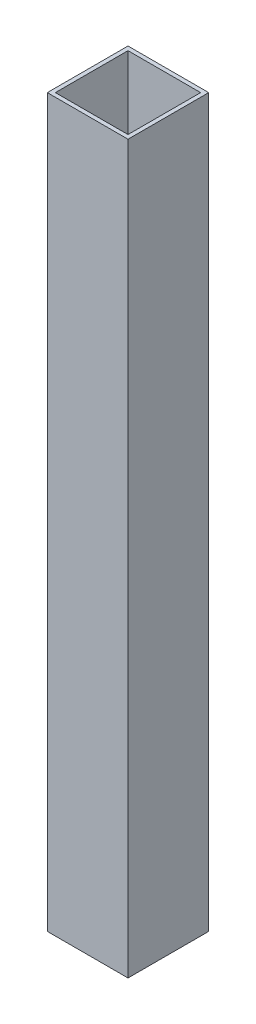
ISO-10303-21;
HEADER;
FILE_DESCRIPTION(('STEP AP214'),'2;1');
FILE_NAME('part.step','',(''),(''),'','','');
FILE_SCHEMA(('AUTOMOTIVE_DESIGN { 1 0 10303 214 1 1 1 1 }'));
ENDSEC;
DATA;
#1=APPLICATION_CONTEXT('core data for automotive mechanical design processes');
#2=APPLICATION_PROTOCOL_DEFINITION('international standard','automotive_design',2000,#1);
#3=PRODUCT_CONTEXT('',#1,'mechanical');
#4=PRODUCT('Part','Part','',(#3));
#5=PRODUCT_RELATED_PRODUCT_CATEGORY('part','',(#4));
#6=PRODUCT_DEFINITION_FORMATION('','',#4);
#7=PRODUCT_DEFINITION_CONTEXT('part definition',#1,'design');
#8=PRODUCT_DEFINITION('design','',#6,#7);
#9=PRODUCT_DEFINITION_SHAPE('','',#8);
#10=(LENGTH_UNIT() NAMED_UNIT(*) SI_UNIT(.MILLI.,.METRE.));
#11=(NAMED_UNIT(*) PLANE_ANGLE_UNIT() SI_UNIT($,.RADIAN.));
#12=(NAMED_UNIT(*) SI_UNIT($,.STERADIAN.) SOLID_ANGLE_UNIT());
#13=UNCERTAINTY_MEASURE_WITH_UNIT(LENGTH_MEASURE(1.E-05),#10,'distance_accuracy_value','');
#14=(GEOMETRIC_REPRESENTATION_CONTEXT(3) GLOBAL_UNCERTAINTY_ASSIGNED_CONTEXT((#13)) GLOBAL_UNIT_ASSIGNED_CONTEXT((#10,
#11,#12)) REPRESENTATION_CONTEXT('',''));
#15=CARTESIAN_POINT('',(0.,0.,0.));
#16=DIRECTION('',(0.,0.,1.));
#17=DIRECTION('',(1.,0.,0.));
#18=AXIS2_PLACEMENT_3D('',#15,#16,#17);
#19=CARTESIAN_POINT('',(0.,0.,50.8));
#20=DIRECTION('',(0.,-1.,0.));
#21=DIRECTION('',(0.,0.,-1.));
#22=AXIS2_PLACEMENT_3D('',#19,#20,#21);
#23=PLANE('',#22);
#24=DIRECTION('',(-1.,0.,0.));
#25=VECTOR('',#24,1.);
#26=CARTESIAN_POINT('',(0.,0.,0.));
#27=LINE('',#26,#25);
#28=CARTESIAN_POINT('',(50.8,0.,0.));
#29=VERTEX_POINT('',#28);
#30=CARTESIAN_POINT('',(0.,0.,0.));
#31=VERTEX_POINT('',#30);
#32=EDGE_CURVE('E140',#29,#31,#27,.T.);
#33=ORIENTED_EDGE('',*,*,#32,.T.);
#34=DIRECTION('',(0.,0.,-1.));
#35=VECTOR('',#34,1.);
#36=CARTESIAN_POINT('',(0.,0.,50.8));
#37=LINE('',#36,#35);
#38=CARTESIAN_POINT('',(0.,0.,50.8));
#39=VERTEX_POINT('',#38);
#40=EDGE_CURVE('E146',#39,#31,#37,.T.);
#41=ORIENTED_EDGE('',*,*,#40,.F.);
#42=DIRECTION('',(-1.,0.,0.));
#43=VECTOR('',#42,1.);
#44=CARTESIAN_POINT('',(0.,0.,50.8));
#45=LINE('',#44,#43);
#46=CARTESIAN_POINT('',(50.8,0.,50.8));
#47=VERTEX_POINT('',#46);
#48=EDGE_CURVE('E144',#47,#39,#45,.T.);
#49=ORIENTED_EDGE('',*,*,#48,.F.);
#50=DIRECTION('',(0.,0.,-1.));
#51=VECTOR('',#50,1.);
#52=CARTESIAN_POINT('',(50.8,0.,50.8));
#53=LINE('',#52,#51);
#54=EDGE_CURVE('E156',#47,#29,#53,.T.);
#55=ORIENTED_EDGE('',*,*,#54,.T.);
#56=EDGE_LOOP('',(#33,#41,#49,#55));
#57=FACE_BOUND('',#56,.T.);
#58=DIRECTION('',(-1.,0.,0.));
#59=VECTOR('',#58,1.);
#60=CARTESIAN_POINT('',(0.,0.,2.54));
#61=LINE('',#60,#59);
#62=CARTESIAN_POINT('',(48.26,0.,2.54));
#63=VERTEX_POINT('',#62);
#64=CARTESIAN_POINT('',(2.54,0.,2.54));
#65=VERTEX_POINT('',#64);
#66=EDGE_CURVE('E107',#63,#65,#61,.T.);
#67=ORIENTED_EDGE('',*,*,#66,.F.);
#68=DIRECTION('',(0.,0.,-1.));
#69=VECTOR('',#68,1.);
#70=CARTESIAN_POINT('',(48.26,0.,50.8));
#71=LINE('',#70,#69);
#72=CARTESIAN_POINT('',(48.26,0.,48.26));
#73=VERTEX_POINT('',#72);
#74=EDGE_CURVE('E131',#73,#63,#71,.T.);
#75=ORIENTED_EDGE('',*,*,#74,.F.);
#76=DIRECTION('',(-1.,0.,0.));
#77=VECTOR('',#76,1.);
#78=CARTESIAN_POINT('',(0.,0.,48.26));
#79=LINE('',#78,#77);
#80=CARTESIAN_POINT('',(2.54,0.,48.26));
#81=VERTEX_POINT('',#80);
#82=EDGE_CURVE('E129',#73,#81,#79,.T.);
#83=ORIENTED_EDGE('',*,*,#82,.T.);
#84=DIRECTION('',(0.,0.,-1.));
#85=VECTOR('',#84,1.);
#86=CARTESIAN_POINT('',(2.54,0.,50.8));
#87=LINE('',#86,#85);
#88=EDGE_CURVE('E105',#81,#65,#87,.T.);
#89=ORIENTED_EDGE('',*,*,#88,.T.);
#90=EDGE_LOOP('',(#67,#75,#83,#89));
#91=FACE_BOUND('',#90,.T.);
#92=ADVANCED_FACE('F34',(#57,#91),#23,.F.);
#93=CARTESIAN_POINT('',(0.,0.,50.8));
#94=DIRECTION('',(1.,0.,0.));
#95=DIRECTION('',(0.,1.,0.));
#96=AXIS2_PLACEMENT_3D('',#93,#94,#95);
#97=PLANE('',#96);
#98=DIRECTION('',(0.,-1.,0.));
#99=VECTOR('',#98,1.);
#100=CARTESIAN_POINT('',(0.,0.,0.));
#101=LINE('',#100,#99);
#102=CARTESIAN_POINT('',(0.,-457.2,0.));
#103=VERTEX_POINT('',#102);
#104=EDGE_CURVE('E134',#31,#103,#101,.T.);
#105=ORIENTED_EDGE('',*,*,#104,.T.);
#106=DIRECTION('',(0.,0.,-1.));
#107=VECTOR('',#106,1.);
#108=CARTESIAN_POINT('',(0.,-457.2,50.8));
#109=LINE('',#108,#107);
#110=CARTESIAN_POINT('',(0.,-457.2,50.8));
#111=VERTEX_POINT('',#110);
#112=EDGE_CURVE('E11',#111,#103,#109,.T.);
#113=ORIENTED_EDGE('',*,*,#112,.F.);
#114=DIRECTION('',(0.,-1.,0.));
#115=VECTOR('',#114,1.);
#116=CARTESIAN_POINT('',(0.,0.,50.8));
#117=LINE('',#116,#115);
#118=EDGE_CURVE('E136',#39,#111,#117,.T.);
#119=ORIENTED_EDGE('',*,*,#118,.F.);
#120=ORIENTED_EDGE('',*,*,#40,.T.);
#121=EDGE_LOOP('',(#105,#113,#119,#120));
#122=FACE_BOUND('',#121,.T.);
#123=ADVANCED_FACE('F36',(#122),#97,.F.);
#124=CARTESIAN_POINT('',(0.,-457.2,50.8));
#125=DIRECTION('',(0.,1.,0.));
#126=DIRECTION('',(0.,0.,1.));
#127=AXIS2_PLACEMENT_3D('',#124,#125,#126);
#128=PLANE('',#127);
#129=DIRECTION('',(-1.,0.,0.));
#130=VECTOR('',#129,1.);
#131=CARTESIAN_POINT('',(48.2600000000001,-457.2,48.26));
#132=LINE('',#131,#130);
#133=CARTESIAN_POINT('',(48.2600000000001,-457.2,48.26));
#134=VERTEX_POINT('',#133);
#135=CARTESIAN_POINT('',(2.54000000000006,-457.2,48.26));
#136=VERTEX_POINT('',#135);
#137=EDGE_CURVE('E110',#134,#136,#132,.T.);
#138=ORIENTED_EDGE('',*,*,#137,.F.);
#139=DIRECTION('',(0.,0.,1.));
#140=VECTOR('',#139,1.);
#141=CARTESIAN_POINT('',(48.2600000000001,-457.2,2.54));
#142=LINE('',#141,#140);
#143=CARTESIAN_POINT('',(48.2600000000001,-457.2,2.54));
#144=VERTEX_POINT('',#143);
#145=EDGE_CURVE('E114',#144,#134,#142,.T.);
#146=ORIENTED_EDGE('',*,*,#145,.F.);
#147=DIRECTION('',(1.,0.,0.));
#148=VECTOR('',#147,1.);
#149=CARTESIAN_POINT('',(2.54000000000006,-457.2,2.54));
#150=LINE('',#149,#148);
#151=CARTESIAN_POINT('',(2.54000000000006,-457.2,2.54));
#152=VERTEX_POINT('',#151);
#153=EDGE_CURVE('E119',#152,#144,#150,.T.);
#154=ORIENTED_EDGE('',*,*,#153,.F.);
#155=DIRECTION('',(0.,0.,-1.));
#156=VECTOR('',#155,1.);
#157=CARTESIAN_POINT('',(2.54000000000006,-457.2,48.26));
#158=LINE('',#157,#156);
#159=EDGE_CURVE('E102',#136,#152,#158,.T.);
#160=ORIENTED_EDGE('',*,*,#159,.F.);
#161=EDGE_LOOP('',(#138,#146,#154,#160));
#162=FACE_BOUND('',#161,.T.);
#163=DIRECTION('',(1.,0.,0.));
#164=VECTOR('',#163,1.);
#165=CARTESIAN_POINT('',(0.,-457.2,0.));
#166=LINE('',#165,#164);
#167=CARTESIAN_POINT('',(50.8000000000001,-457.2,0.));
#168=VERTEX_POINT('',#167);
#169=EDGE_CURVE('E149',#103,#168,#166,.T.);
#170=ORIENTED_EDGE('',*,*,#169,.T.);
#171=DIRECTION('',(0.,0.,-1.));
#172=VECTOR('',#171,1.);
#173=CARTESIAN_POINT('',(50.8000000000001,-457.2,50.8));
#174=LINE('',#173,#172);
#175=CARTESIAN_POINT('',(50.8000000000001,-457.2,50.8));
#176=VERTEX_POINT('',#175);
#177=EDGE_CURVE('E42',#176,#168,#174,.T.);
#178=ORIENTED_EDGE('',*,*,#177,.F.);
#179=DIRECTION('',(1.,0.,0.));
#180=VECTOR('',#179,1.);
#181=CARTESIAN_POINT('',(0.,-457.2,50.8));
#182=LINE('',#181,#180);
#183=EDGE_CURVE('E139',#111,#176,#182,.T.);
#184=ORIENTED_EDGE('',*,*,#183,.F.);
#185=ORIENTED_EDGE('',*,*,#112,.T.);
#186=EDGE_LOOP('',(#170,#178,#184,#185));
#187=FACE_BOUND('',#186,.T.);
#188=ADVANCED_FACE('F116',(#162,#187),#128,.F.);
#189=CARTESIAN_POINT('',(50.8,0.,50.8));
#190=DIRECTION('',(-1.,0.,0.));
#191=DIRECTION('',(0.,-1.,0.));
#192=AXIS2_PLACEMENT_3D('',#189,#190,#191);
#193=PLANE('',#192);
#194=DIRECTION('',(0.,1.,0.));
#195=VECTOR('',#194,1.);
#196=CARTESIAN_POINT('',(50.8,0.,0.));
#197=LINE('',#196,#195);
#198=EDGE_CURVE('E151',#168,#29,#197,.T.);
#199=ORIENTED_EDGE('',*,*,#198,.T.);
#200=ORIENTED_EDGE('',*,*,#54,.F.);
#201=DIRECTION('',(0.,1.,0.));
#202=VECTOR('',#201,1.);
#203=CARTESIAN_POINT('',(50.8,0.,50.8));
#204=LINE('',#203,#202);
#205=EDGE_CURVE('E142',#176,#47,#204,.T.);
#206=ORIENTED_EDGE('',*,*,#205,.F.);
#207=ORIENTED_EDGE('',*,*,#177,.T.);
#208=EDGE_LOOP('',(#199,#200,#206,#207));
#209=FACE_BOUND('',#208,.T.);
#210=ADVANCED_FACE('F163',(#209),#193,.F.);
#211=CARTESIAN_POINT('',(0.,0.,50.8));
#212=DIRECTION('',(0.,0.,1.));
#213=DIRECTION('',(1.,0.,0.));
#214=AXIS2_PLACEMENT_3D('',#211,#212,#213);
#215=PLANE('',#214);
#216=ORIENTED_EDGE('',*,*,#118,.T.);
#217=ORIENTED_EDGE('',*,*,#183,.T.);
#218=ORIENTED_EDGE('',*,*,#205,.T.);
#219=ORIENTED_EDGE('',*,*,#48,.T.);
#220=EDGE_LOOP('',(#216,#217,#218,#219));
#221=FACE_BOUND('',#220,.T.);
#222=ADVANCED_FACE('F177',(#221),#215,.T.);
#223=CARTESIAN_POINT('',(0.,0.,0.));
#224=DIRECTION('',(0.,0.,1.));
#225=DIRECTION('',(1.,0.,0.));
#226=AXIS2_PLACEMENT_3D('',#223,#224,#225);
#227=PLANE('',#226);
#228=ORIENTED_EDGE('',*,*,#104,.F.);
#229=ORIENTED_EDGE('',*,*,#32,.F.);
#230=ORIENTED_EDGE('',*,*,#198,.F.);
#231=ORIENTED_EDGE('',*,*,#169,.F.);
#232=EDGE_LOOP('',(#228,#229,#230,#231));
#233=FACE_BOUND('',#232,.T.);
#234=ADVANCED_FACE('F168',(#233),#227,.F.);
#235=CARTESIAN_POINT('',(2.54,0.,50.8));
#236=DIRECTION('',(1.,0.,0.));
#237=DIRECTION('',(0.,1.,0.));
#238=AXIS2_PLACEMENT_3D('',#235,#236,#237);
#239=PLANE('',#238);
#240=ORIENTED_EDGE('',*,*,#159,.T.);
#241=DIRECTION('',(0.,-1.,0.));
#242=VECTOR('',#241,1.);
#243=CARTESIAN_POINT('',(2.54,0.,2.54));
#244=LINE('',#243,#242);
#245=EDGE_CURVE('E121',#65,#152,#244,.T.);
#246=ORIENTED_EDGE('',*,*,#245,.F.);
#247=ORIENTED_EDGE('',*,*,#88,.F.);
#248=DIRECTION('',(0.,-1.,0.));
#249=VECTOR('',#248,1.);
#250=CARTESIAN_POINT('',(2.54,0.,48.26));
#251=LINE('',#250,#249);
#252=EDGE_CURVE('E98',#81,#136,#251,.T.);
#253=ORIENTED_EDGE('',*,*,#252,.T.);
#254=EDGE_LOOP('',(#240,#246,#247,#253));
#255=FACE_BOUND('',#254,.T.);
#256=ADVANCED_FACE('F99',(#255),#239,.T.);
#257=CARTESIAN_POINT('',(48.26,0.,50.8));
#258=DIRECTION('',(-1.,0.,0.));
#259=DIRECTION('',(0.,-1.,0.));
#260=AXIS2_PLACEMENT_3D('',#257,#258,#259);
#261=PLANE('',#260);
#262=DIRECTION('',(0.,1.,0.));
#263=VECTOR('',#262,1.);
#264=CARTESIAN_POINT('',(48.26,0.,48.26));
#265=LINE('',#264,#263);
#266=EDGE_CURVE('E49',#134,#73,#265,.T.);
#267=ORIENTED_EDGE('',*,*,#266,.T.);
#268=ORIENTED_EDGE('',*,*,#74,.T.);
#269=DIRECTION('',(0.,1.,0.));
#270=VECTOR('',#269,1.);
#271=CARTESIAN_POINT('',(48.26,0.,2.54));
#272=LINE('',#271,#270);
#273=EDGE_CURVE('E125',#144,#63,#272,.T.);
#274=ORIENTED_EDGE('',*,*,#273,.F.);
#275=ORIENTED_EDGE('',*,*,#145,.T.);
#276=EDGE_LOOP('',(#267,#268,#274,#275));
#277=FACE_BOUND('',#276,.T.);
#278=ADVANCED_FACE('F199',(#277),#261,.T.);
#279=CARTESIAN_POINT('',(0.,0.,48.26));
#280=DIRECTION('',(0.,0.,1.));
#281=DIRECTION('',(1.,0.,0.));
#282=AXIS2_PLACEMENT_3D('',#279,#280,#281);
#283=PLANE('',#282);
#284=ORIENTED_EDGE('',*,*,#137,.T.);
#285=ORIENTED_EDGE('',*,*,#252,.F.);
#286=ORIENTED_EDGE('',*,*,#82,.F.);
#287=ORIENTED_EDGE('',*,*,#266,.F.);
#288=EDGE_LOOP('',(#284,#285,#286,#287));
#289=FACE_BOUND('',#288,.T.);
#290=ADVANCED_FACE('F111',(#289),#283,.F.);
#291=CARTESIAN_POINT('',(0.,0.,2.54));
#292=DIRECTION('',(0.,0.,1.));
#293=DIRECTION('',(1.,0.,0.));
#294=AXIS2_PLACEMENT_3D('',#291,#292,#293);
#295=PLANE('',#294);
#296=ORIENTED_EDGE('',*,*,#273,.T.);
#297=ORIENTED_EDGE('',*,*,#66,.T.);
#298=ORIENTED_EDGE('',*,*,#245,.T.);
#299=ORIENTED_EDGE('',*,*,#153,.T.);
#300=EDGE_LOOP('',(#296,#297,#298,#299));
#301=FACE_BOUND('',#300,.T.);
#302=ADVANCED_FACE('F193',(#301),#295,.T.);
#303=CLOSED_SHELL('',(#92,#123,#188,#210,#222,#234,#256,#278,#290,#302));
#304=MANIFOLD_SOLID_BREP('B2',#303);
#305=ADVANCED_BREP_SHAPE_REPRESENTATION('',(#18,#304),#14);
#306=SHAPE_DEFINITION_REPRESENTATION(#9,#305);
ENDSEC;
END-ISO-10303-21;
